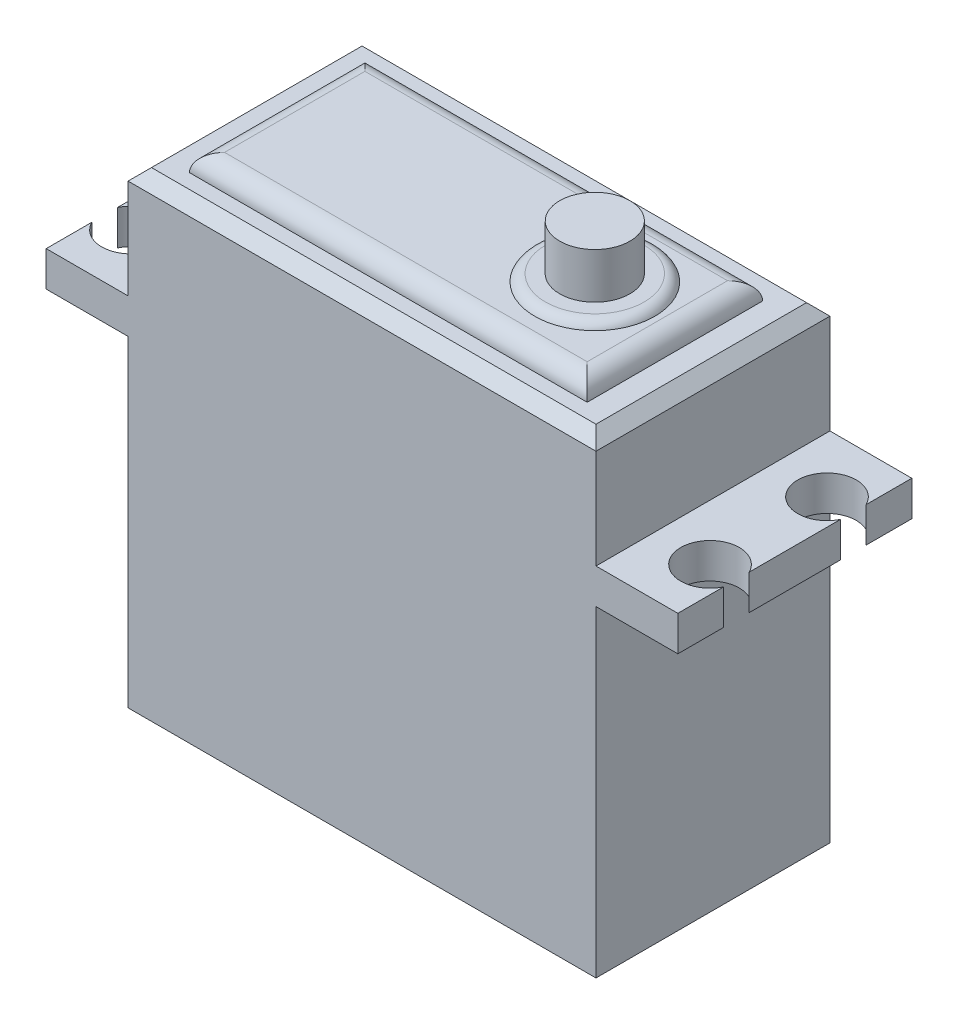
ISO-10303-21;
HEADER;
FILE_DESCRIPTION(('STEP AP214'),'2;1');
FILE_NAME('part.step','',(''),(''),'','','');
FILE_SCHEMA(('AUTOMOTIVE_DESIGN { 1 0 10303 214 1 1 1 1 }'));
ENDSEC;
DATA;
#1=APPLICATION_CONTEXT('core data for automotive mechanical design processes');
#2=APPLICATION_PROTOCOL_DEFINITION('international standard','automotive_design',2000,#1);
#3=PRODUCT_CONTEXT('',#1,'mechanical');
#4=PRODUCT('Part','Part','',(#3));
#5=PRODUCT_RELATED_PRODUCT_CATEGORY('part','',(#4));
#6=PRODUCT_DEFINITION_FORMATION('','',#4);
#7=PRODUCT_DEFINITION_CONTEXT('part definition',#1,'design');
#8=PRODUCT_DEFINITION('design','',#6,#7);
#9=PRODUCT_DEFINITION_SHAPE('','',#8);
#10=(LENGTH_UNIT() NAMED_UNIT(*) SI_UNIT(.MILLI.,.METRE.));
#11=(NAMED_UNIT(*) PLANE_ANGLE_UNIT() SI_UNIT($,.RADIAN.));
#12=(NAMED_UNIT(*) SI_UNIT($,.STERADIAN.) SOLID_ANGLE_UNIT());
#13=UNCERTAINTY_MEASURE_WITH_UNIT(LENGTH_MEASURE(1.E-05),#10,'distance_accuracy_value','');
#14=(GEOMETRIC_REPRESENTATION_CONTEXT(3) GLOBAL_UNCERTAINTY_ASSIGNED_CONTEXT((#13)) GLOBAL_UNIT_ASSIGNED_CONTEXT((#10,
#11,#12)) REPRESENTATION_CONTEXT('',''));
#15=CARTESIAN_POINT('',(0.,0.,0.));
#16=DIRECTION('',(0.,0.,1.));
#17=DIRECTION('',(1.,0.,0.));
#18=AXIS2_PLACEMENT_3D('',#15,#16,#17);
#19=CARTESIAN_POINT('',(0.,40.,0.));
#20=DIRECTION('',(0.,1.,0.));
#21=DIRECTION('',(0.,0.,1.));
#22=AXIS2_PLACEMENT_3D('',#19,#20,#21);
#23=PLANE('',#22);
#24=DIRECTION('',(-1.,0.,0.));
#25=VECTOR('',#24,1.);
#26=CARTESIAN_POINT('',(0.,40.,1.00000000000001));
#27=LINE('',#26,#25);
#28=CARTESIAN_POINT('',(39.,40.,1.00000000000001));
#29=VERTEX_POINT('',#28);
#30=CARTESIAN_POINT('',(1.00000000000001,40.,1.00000000000001));
#31=VERTEX_POINT('',#30);
#32=EDGE_CURVE('E254',#29,#31,#27,.T.);
#33=ORIENTED_EDGE('',*,*,#32,.T.);
#34=DIRECTION('',(0.,0.,1.));
#35=VECTOR('',#34,1.);
#36=CARTESIAN_POINT('',(1.00000000000001,40.,20.));
#37=LINE('',#36,#35);
#38=CARTESIAN_POINT('',(1.00000000000001,40.,19.));
#39=VERTEX_POINT('',#38);
#40=EDGE_CURVE('E260',#31,#39,#37,.T.);
#41=ORIENTED_EDGE('',*,*,#40,.T.);
#42=DIRECTION('',(1.,0.,0.));
#43=VECTOR('',#42,1.);
#44=CARTESIAN_POINT('',(40.,40.,19.));
#45=LINE('',#44,#43);
#46=CARTESIAN_POINT('',(39.,40.,19.));
#47=VERTEX_POINT('',#46);
#48=EDGE_CURVE('E258',#39,#47,#45,.T.);
#49=ORIENTED_EDGE('',*,*,#48,.T.);
#50=DIRECTION('',(0.,0.,-1.));
#51=VECTOR('',#50,1.);
#52=CARTESIAN_POINT('',(39.,40.,0.));
#53=LINE('',#52,#51);
#54=EDGE_CURVE('E256',#47,#29,#53,.T.);
#55=ORIENTED_EDGE('',*,*,#54,.T.);
#56=EDGE_LOOP('',(#33,#41,#49,#55));
#57=FACE_BOUND('',#56,.T.);
#58=DIRECTION('',(1.,0.,0.));
#59=VECTOR('',#58,1.);
#60=CARTESIAN_POINT('',(2.99999999999999,40.,17.7515960619115));
#61=LINE('',#60,#59);
#62=CARTESIAN_POINT('',(2.99999999999999,40.,17.7515960619115));
#63=VERTEX_POINT('',#62);
#64=CARTESIAN_POINT('',(37.,40.,17.7515960619115));
#65=VERTEX_POINT('',#64);
#66=EDGE_CURVE('E212',#63,#65,#61,.T.);
#67=ORIENTED_EDGE('',*,*,#66,.F.);
#68=DIRECTION('',(0.,0.,1.));
#69=VECTOR('',#68,1.);
#70=CARTESIAN_POINT('',(2.99999999999999,40.,17.7515960619115));
#71=LINE('',#70,#69);
#72=CARTESIAN_POINT('',(2.99999999999999,40.,2.75159606191146));
#73=VERTEX_POINT('',#72);
#74=EDGE_CURVE('E214',#73,#63,#71,.T.);
#75=ORIENTED_EDGE('',*,*,#74,.F.);
#76=DIRECTION('',(-1.,0.,0.));
#77=VECTOR('',#76,1.);
#78=CARTESIAN_POINT('',(2.99999999999999,40.,2.75159606191146));
#79=LINE('',#78,#77);
#80=CARTESIAN_POINT('',(37.,40.,2.75159606191146));
#81=VERTEX_POINT('',#80);
#82=EDGE_CURVE('E573',#81,#73,#79,.T.);
#83=ORIENTED_EDGE('',*,*,#82,.F.);
#84=DIRECTION('',(0.,0.,-1.));
#85=VECTOR('',#84,1.);
#86=CARTESIAN_POINT('',(37.,40.,17.7515960619115));
#87=LINE('',#86,#85);
#88=EDGE_CURVE('E216',#65,#81,#87,.T.);
#89=ORIENTED_EDGE('',*,*,#88,.F.);
#90=EDGE_LOOP('',(#67,#75,#83,#89));
#91=FACE_BOUND('',#90,.T.);
#92=ADVANCED_FACE('F39',(#57,#91),#23,.T.);
#93=CARTESIAN_POINT('',(0.,40.,0.));
#94=DIRECTION('',(1.,0.,0.));
#95=DIRECTION('',(0.,0.,-1.));
#96=AXIS2_PLACEMENT_3D('',#93,#94,#95);
#97=PLANE('',#96);
#98=DIRECTION('',(0.,0.,1.));
#99=VECTOR('',#98,1.);
#100=CARTESIAN_POINT('',(0.,27.5,20.));
#101=LINE('',#100,#99);
#102=CARTESIAN_POINT('',(0.,27.5,0.));
#103=VERTEX_POINT('',#102);
#104=CARTESIAN_POINT('',(0.,27.5,20.));
#105=VERTEX_POINT('',#104);
#106=EDGE_CURVE('E608',#103,#105,#101,.T.);
#107=ORIENTED_EDGE('',*,*,#106,.F.);
#108=DIRECTION('',(0.,-1.,0.));
#109=VECTOR('',#108,1.);
#110=CARTESIAN_POINT('',(0.,40.,0.));
#111=LINE('',#110,#109);
#112=CARTESIAN_POINT('',(0.,0.,0.));
#113=VERTEX_POINT('',#112);
#114=EDGE_CURVE('E703',#103,#113,#111,.T.);
#115=ORIENTED_EDGE('',*,*,#114,.T.);
#116=DIRECTION('',(0.,0.,1.));
#117=VECTOR('',#116,1.);
#118=CARTESIAN_POINT('',(0.,0.,0.));
#119=LINE('',#118,#117);
#120=CARTESIAN_POINT('',(0.,0.,20.));
#121=VERTEX_POINT('',#120);
#122=EDGE_CURVE('E682',#113,#121,#119,.T.);
#123=ORIENTED_EDGE('',*,*,#122,.T.);
#124=DIRECTION('',(0.,-1.,0.));
#125=VECTOR('',#124,1.);
#126=CARTESIAN_POINT('',(0.,40.,20.));
#127=LINE('',#126,#125);
#128=EDGE_CURVE('E303',#105,#121,#127,.T.);
#129=ORIENTED_EDGE('',*,*,#128,.F.);
#130=EDGE_LOOP('',(#107,#115,#123,#129));
#131=FACE_BOUND('',#130,.T.);
#132=ADVANCED_FACE('F310',(#131),#97,.F.);
#133=CARTESIAN_POINT('',(40.,40.,0.));
#134=DIRECTION('',(-1.,0.,0.));
#135=DIRECTION('',(0.,0.,1.));
#136=AXIS2_PLACEMENT_3D('',#133,#134,#135);
#137=PLANE('',#136);
#138=DIRECTION('',(0.,0.,-1.));
#139=VECTOR('',#138,1.);
#140=CARTESIAN_POINT('',(40.,27.5,20.));
#141=LINE('',#140,#139);
#142=CARTESIAN_POINT('',(40.,27.5,20.));
#143=VERTEX_POINT('',#142);
#144=CARTESIAN_POINT('',(40.,27.5,0.));
#145=VERTEX_POINT('',#144);
#146=EDGE_CURVE('E624',#143,#145,#141,.T.);
#147=ORIENTED_EDGE('',*,*,#146,.F.);
#148=DIRECTION('',(0.,-1.,0.));
#149=VECTOR('',#148,1.);
#150=CARTESIAN_POINT('',(40.,40.,20.));
#151=LINE('',#150,#149);
#152=CARTESIAN_POINT('',(40.,0.,20.));
#153=VERTEX_POINT('',#152);
#154=EDGE_CURVE('E709',#143,#153,#151,.T.);
#155=ORIENTED_EDGE('',*,*,#154,.T.);
#156=DIRECTION('',(0.,0.,-1.));
#157=VECTOR('',#156,1.);
#158=CARTESIAN_POINT('',(40.,0.,0.));
#159=LINE('',#158,#157);
#160=CARTESIAN_POINT('',(40.,0.,0.));
#161=VERTEX_POINT('',#160);
#162=EDGE_CURVE('E697',#153,#161,#159,.T.);
#163=ORIENTED_EDGE('',*,*,#162,.T.);
#164=DIRECTION('',(0.,-1.,0.));
#165=VECTOR('',#164,1.);
#166=CARTESIAN_POINT('',(40.,40.,0.));
#167=LINE('',#166,#165);
#168=EDGE_CURVE('E706',#145,#161,#167,.T.);
#169=ORIENTED_EDGE('',*,*,#168,.F.);
#170=EDGE_LOOP('',(#147,#155,#163,#169));
#171=FACE_BOUND('',#170,.T.);
#172=ADVANCED_FACE('F317',(#171),#137,.F.);
#173=CARTESIAN_POINT('',(0.,39.,20.));
#174=VERTEX_POINT('',#173);
#175=CARTESIAN_POINT('',(0.,30.5,20.));
#176=VERTEX_POINT('',#175);
#177=EDGE_CURVE('E292',#174,#176,#127,.T.);
#178=ORIENTED_EDGE('',*,*,#177,.F.);
#179=DIRECTION('',(0.,0.,-1.));
#180=VECTOR('',#179,1.);
#181=CARTESIAN_POINT('',(0.,39.,0.));
#182=LINE('',#181,#180);
#183=CARTESIAN_POINT('',(0.,39.,0.));
#184=VERTEX_POINT('',#183);
#185=EDGE_CURVE('E263',#174,#184,#182,.T.);
#186=ORIENTED_EDGE('',*,*,#185,.T.);
#187=CARTESIAN_POINT('',(0.,30.5,0.));
#188=VERTEX_POINT('',#187);
#189=EDGE_CURVE('E704',#184,#188,#111,.T.);
#190=ORIENTED_EDGE('',*,*,#189,.T.);
#191=DIRECTION('',(0.,0.,1.));
#192=VECTOR('',#191,1.);
#193=CARTESIAN_POINT('',(0.,30.5,20.));
#194=LINE('',#193,#192);
#195=EDGE_CURVE('E301',#188,#176,#194,.T.);
#196=ORIENTED_EDGE('',*,*,#195,.T.);
#197=EDGE_LOOP('',(#178,#186,#190,#196));
#198=FACE_BOUND('',#197,.T.);
#199=ADVANCED_FACE('F299',(#198),#97,.F.);
#200=CARTESIAN_POINT('',(0.,40.,20.));
#201=DIRECTION('',(0.,0.,-1.));
#202=DIRECTION('',(-1.,0.,0.));
#203=AXIS2_PLACEMENT_3D('',#200,#201,#202);
#204=PLANE('',#203);
#205=CARTESIAN_POINT('',(40.,39.,20.));
#206=VERTEX_POINT('',#205);
#207=CARTESIAN_POINT('',(40.,30.5,20.));
#208=VERTEX_POINT('',#207);
#209=EDGE_CURVE('E295',#206,#208,#151,.T.);
#210=ORIENTED_EDGE('',*,*,#209,.F.);
#211=DIRECTION('',(-1.,0.,0.));
#212=VECTOR('',#211,1.);
#213=CARTESIAN_POINT('',(0.,39.,20.));
#214=LINE('',#213,#212);
#215=EDGE_CURVE('E266',#206,#174,#214,.T.);
#216=ORIENTED_EDGE('',*,*,#215,.T.);
#217=ORIENTED_EDGE('',*,*,#177,.T.);
#218=DIRECTION('',(-1.,0.,0.));
#219=VECTOR('',#218,1.);
#220=CARTESIAN_POINT('',(0.,30.5,20.));
#221=LINE('',#220,#219);
#222=CARTESIAN_POINT('',(-7.,30.5,20.));
#223=VERTEX_POINT('',#222);
#224=EDGE_CURVE('E592',#176,#223,#221,.T.);
#225=ORIENTED_EDGE('',*,*,#224,.T.);
#226=DIRECTION('',(0.,-1.,0.));
#227=VECTOR('',#226,1.);
#228=CARTESIAN_POINT('',(-7.,30.5,20.));
#229=LINE('',#228,#227);
#230=CARTESIAN_POINT('',(-7.,27.5,20.));
#231=VERTEX_POINT('',#230);
#232=EDGE_CURVE('E629',#223,#231,#229,.T.);
#233=ORIENTED_EDGE('',*,*,#232,.T.);
#234=DIRECTION('',(-1.,0.,0.));
#235=VECTOR('',#234,1.);
#236=CARTESIAN_POINT('',(0.,27.5,20.));
#237=LINE('',#236,#235);
#238=EDGE_CURVE('E611',#105,#231,#237,.T.);
#239=ORIENTED_EDGE('',*,*,#238,.F.);
#240=ORIENTED_EDGE('',*,*,#128,.T.);
#241=DIRECTION('',(1.,0.,0.));
#242=VECTOR('',#241,1.);
#243=CARTESIAN_POINT('',(0.,0.,20.));
#244=LINE('',#243,#242);
#245=EDGE_CURVE('E694',#121,#153,#244,.T.);
#246=ORIENTED_EDGE('',*,*,#245,.T.);
#247=ORIENTED_EDGE('',*,*,#154,.F.);
#248=DIRECTION('',(-1.,0.,0.));
#249=VECTOR('',#248,1.);
#250=CARTESIAN_POINT('',(40.,27.5,20.));
#251=LINE('',#250,#249);
#252=CARTESIAN_POINT('',(47.,27.5,20.));
#253=VERTEX_POINT('',#252);
#254=EDGE_CURVE('E638',#253,#143,#251,.T.);
#255=ORIENTED_EDGE('',*,*,#254,.F.);
#256=DIRECTION('',(0.,-1.,0.));
#257=VECTOR('',#256,1.);
#258=CARTESIAN_POINT('',(47.,30.5,20.));
#259=LINE('',#258,#257);
#260=CARTESIAN_POINT('',(47.,30.5,20.));
#261=VERTEX_POINT('',#260);
#262=EDGE_CURVE('E680',#261,#253,#259,.T.);
#263=ORIENTED_EDGE('',*,*,#262,.F.);
#264=DIRECTION('',(-1.,0.,0.));
#265=VECTOR('',#264,1.);
#266=CARTESIAN_POINT('',(40.,30.5,20.));
#267=LINE('',#266,#265);
#268=EDGE_CURVE('E656',#261,#208,#267,.T.);
#269=ORIENTED_EDGE('',*,*,#268,.T.);
#270=EDGE_LOOP('',(#210,#216,#217,#225,#233,#239,#240,#246,#247,#255,#263,#269));
#271=FACE_BOUND('',#270,.T.);
#272=ADVANCED_FACE('F290',(#271),#204,.F.);
#273=CARTESIAN_POINT('',(40.,39.,0.));
#274=VERTEX_POINT('',#273);
#275=CARTESIAN_POINT('',(40.,30.5,0.));
#276=VERTEX_POINT('',#275);
#277=EDGE_CURVE('E707',#274,#276,#167,.T.);
#278=ORIENTED_EDGE('',*,*,#277,.F.);
#279=DIRECTION('',(0.,0.,1.));
#280=VECTOR('',#279,1.);
#281=CARTESIAN_POINT('',(40.,39.,20.));
#282=LINE('',#281,#280);
#283=EDGE_CURVE('E48',#274,#206,#282,.T.);
#284=ORIENTED_EDGE('',*,*,#283,.T.);
#285=ORIENTED_EDGE('',*,*,#209,.T.);
#286=DIRECTION('',(0.,0.,-1.));
#287=VECTOR('',#286,1.);
#288=CARTESIAN_POINT('',(40.,30.5,20.));
#289=LINE('',#288,#287);
#290=EDGE_CURVE('E634',#208,#276,#289,.T.);
#291=ORIENTED_EDGE('',*,*,#290,.T.);
#292=EDGE_LOOP('',(#278,#284,#285,#291));
#293=FACE_BOUND('',#292,.T.);
#294=ADVANCED_FACE('F332',(#293),#137,.F.);
#295=CARTESIAN_POINT('',(0.,40.,0.));
#296=DIRECTION('',(0.,0.,1.));
#297=DIRECTION('',(1.,0.,0.));
#298=AXIS2_PLACEMENT_3D('',#295,#296,#297);
#299=PLANE('',#298);
#300=ORIENTED_EDGE('',*,*,#189,.F.);
#301=DIRECTION('',(1.,0.,0.));
#302=VECTOR('',#301,1.);
#303=CARTESIAN_POINT('',(40.,39.,0.));
#304=LINE('',#303,#302);
#305=EDGE_CURVE('E11',#184,#274,#304,.T.);
#306=ORIENTED_EDGE('',*,*,#305,.T.);
#307=ORIENTED_EDGE('',*,*,#277,.T.);
#308=DIRECTION('',(1.,0.,0.));
#309=VECTOR('',#308,1.);
#310=CARTESIAN_POINT('',(47.,30.5,0.));
#311=LINE('',#310,#309);
#312=CARTESIAN_POINT('',(47.,30.5,0.));
#313=VERTEX_POINT('',#312);
#314=EDGE_CURVE('E637',#276,#313,#311,.T.);
#315=ORIENTED_EDGE('',*,*,#314,.T.);
#316=DIRECTION('',(0.,-1.,0.));
#317=VECTOR('',#316,1.);
#318=CARTESIAN_POINT('',(47.,30.5,0.));
#319=LINE('',#318,#317);
#320=CARTESIAN_POINT('',(47.,27.5,0.));
#321=VERTEX_POINT('',#320);
#322=EDGE_CURVE('E658',#313,#321,#319,.T.);
#323=ORIENTED_EDGE('',*,*,#322,.T.);
#324=DIRECTION('',(1.,0.,0.));
#325=VECTOR('',#324,1.);
#326=CARTESIAN_POINT('',(47.,27.5,0.));
#327=LINE('',#326,#325);
#328=EDGE_CURVE('E661',#145,#321,#327,.T.);
#329=ORIENTED_EDGE('',*,*,#328,.F.);
#330=ORIENTED_EDGE('',*,*,#168,.T.);
#331=DIRECTION('',(-1.,0.,0.));
#332=VECTOR('',#331,1.);
#333=CARTESIAN_POINT('',(0.,0.,0.));
#334=LINE('',#333,#332);
#335=EDGE_CURVE('E700',#161,#113,#334,.T.);
#336=ORIENTED_EDGE('',*,*,#335,.T.);
#337=ORIENTED_EDGE('',*,*,#114,.F.);
#338=DIRECTION('',(1.,0.,0.));
#339=VECTOR('',#338,1.);
#340=CARTESIAN_POINT('',(-6.99999999999999,27.5,0.));
#341=LINE('',#340,#339);
#342=CARTESIAN_POINT('',(-6.99999999999999,27.5,0.));
#343=VERTEX_POINT('',#342);
#344=EDGE_CURVE('E606',#343,#103,#341,.T.);
#345=ORIENTED_EDGE('',*,*,#344,.F.);
#346=DIRECTION('',(0.,-1.,0.));
#347=VECTOR('',#346,1.);
#348=CARTESIAN_POINT('',(-6.99999999999999,30.5,0.));
#349=LINE('',#348,#347);
#350=CARTESIAN_POINT('',(-6.99999999999999,30.5,0.));
#351=VERTEX_POINT('',#350);
#352=EDGE_CURVE('E631',#351,#343,#349,.T.);
#353=ORIENTED_EDGE('',*,*,#352,.F.);
#354=DIRECTION('',(1.,0.,0.));
#355=VECTOR('',#354,1.);
#356=CARTESIAN_POINT('',(-6.99999999999999,30.5,0.));
#357=LINE('',#356,#355);
#358=EDGE_CURVE('E588',#351,#188,#357,.T.);
#359=ORIENTED_EDGE('',*,*,#358,.T.);
#360=EDGE_LOOP('',(#300,#306,#307,#315,#323,#329,#330,#336,#337,#345,#353,#359));
#361=FACE_BOUND('',#360,.T.);
#362=ADVANCED_FACE('F328',(#361),#299,.F.);
#363=CARTESIAN_POINT('',(0.,0.,0.));
#364=DIRECTION('',(0.,1.,0.));
#365=DIRECTION('',(0.,0.,1.));
#366=AXIS2_PLACEMENT_3D('',#363,#364,#365);
#367=PLANE('',#366);
#368=ORIENTED_EDGE('',*,*,#122,.F.);
#369=ORIENTED_EDGE('',*,*,#335,.F.);
#370=ORIENTED_EDGE('',*,*,#162,.F.);
#371=ORIENTED_EDGE('',*,*,#245,.F.);
#372=EDGE_LOOP('',(#368,#369,#370,#371));
#373=FACE_BOUND('',#372,.T.);
#374=ADVANCED_FACE('F324',(#373),#367,.F.);
#375=CARTESIAN_POINT('',(47.,30.5,20.));
#376=DIRECTION('',(1.,0.,0.));
#377=DIRECTION('',(0.,0.,-1.));
#378=AXIS2_PLACEMENT_3D('',#375,#376,#377);
#379=PLANE('',#378);
#380=DIRECTION('',(0.,0.,1.));
#381=VECTOR('',#380,1.);
#382=CARTESIAN_POINT('',(47.,27.5,20.));
#383=LINE('',#382,#381);
#384=CARTESIAN_POINT('',(47.,27.5,16.0897247358852));
#385=VERTEX_POINT('',#384);
#386=EDGE_CURVE('E676',#385,#253,#383,.T.);
#387=ORIENTED_EDGE('',*,*,#386,.F.);
#388=DIRECTION('',(0.,-1.,0.));
#389=VECTOR('',#388,1.);
#390=CARTESIAN_POINT('',(47.,30.5,16.0897247358852));
#391=LINE('',#390,#389);
#392=CARTESIAN_POINT('',(47.,30.5,16.0897247358852));
#393=VERTEX_POINT('',#392);
#394=EDGE_CURVE('E683',#393,#385,#391,.T.);
#395=ORIENTED_EDGE('',*,*,#394,.F.);
#396=DIRECTION('',(0.,0.,1.));
#397=VECTOR('',#396,1.);
#398=CARTESIAN_POINT('',(47.,30.5,20.));
#399=LINE('',#398,#397);
#400=EDGE_CURVE('E653',#393,#261,#399,.T.);
#401=ORIENTED_EDGE('',*,*,#400,.T.);
#402=ORIENTED_EDGE('',*,*,#262,.T.);
#403=EDGE_LOOP('',(#387,#395,#401,#402));
#404=FACE_BOUND('',#403,.T.);
#405=ADVANCED_FACE('F327',(#404),#379,.T.);
#406=CARTESIAN_POINT('',(44.75,30.5,15.));
#407=DIRECTION('',(0.,-1.,0.));
#408=DIRECTION('',(0.,0.,-1.));
#409=AXIS2_PLACEMENT_3D('',#406,#407,#408);
#410=CYLINDRICAL_SURFACE('',#409,2.5);
#411=CARTESIAN_POINT('',(44.75,27.5,15.));
#412=DIRECTION('',(0.,1.,0.));
#413=DIRECTION('',(0.,0.,-1.));
#414=AXIS2_PLACEMENT_3D('',#411,#412,#413);
#415=CIRCLE('',#414,2.5);
#416=CARTESIAN_POINT('',(47.,27.5,13.9102752641148));
#417=VERTEX_POINT('',#416);
#418=EDGE_CURVE('E673',#417,#385,#415,.T.);
#419=ORIENTED_EDGE('',*,*,#418,.F.);
#420=DIRECTION('',(0.,-1.,0.));
#421=VECTOR('',#420,1.);
#422=CARTESIAN_POINT('',(47.,30.5,13.9102752641148));
#423=LINE('',#422,#421);
#424=CARTESIAN_POINT('',(47.,30.5,13.9102752641148));
#425=VERTEX_POINT('',#424);
#426=EDGE_CURVE('E685',#425,#417,#423,.T.);
#427=ORIENTED_EDGE('',*,*,#426,.F.);
#428=CARTESIAN_POINT('',(44.75,30.5,15.));
#429=DIRECTION('',(0.,1.,0.));
#430=DIRECTION('',(0.,0.,-1.));
#431=AXIS2_PLACEMENT_3D('',#428,#429,#430);
#432=CIRCLE('',#431,2.5);
#433=EDGE_CURVE('E650',#425,#393,#432,.T.);
#434=ORIENTED_EDGE('',*,*,#433,.T.);
#435=ORIENTED_EDGE('',*,*,#394,.T.);
#436=EDGE_LOOP('',(#419,#427,#434,#435));
#437=FACE_BOUND('',#436,.T.);
#438=ADVANCED_FACE('F413',(#437),#410,.F.);
#439=CARTESIAN_POINT('',(47.,30.5,13.9102752641148));
#440=DIRECTION('',(1.,0.,0.));
#441=DIRECTION('',(0.,0.,-1.));
#442=AXIS2_PLACEMENT_3D('',#439,#440,#441);
#443=PLANE('',#442);
#444=DIRECTION('',(0.,0.,1.));
#445=VECTOR('',#444,1.);
#446=CARTESIAN_POINT('',(47.,27.5,13.9102752641148));
#447=LINE('',#446,#445);
#448=CARTESIAN_POINT('',(47.,27.5,6.08972473588517));
#449=VERTEX_POINT('',#448);
#450=EDGE_CURVE('E670',#449,#417,#447,.T.);
#451=ORIENTED_EDGE('',*,*,#450,.F.);
#452=DIRECTION('',(0.,-1.,0.));
#453=VECTOR('',#452,1.);
#454=CARTESIAN_POINT('',(47.,30.5,6.08972473588517));
#455=LINE('',#454,#453);
#456=CARTESIAN_POINT('',(47.,30.5,6.08972473588517));
#457=VERTEX_POINT('',#456);
#458=EDGE_CURVE('E687',#457,#449,#455,.T.);
#459=ORIENTED_EDGE('',*,*,#458,.F.);
#460=DIRECTION('',(0.,0.,1.));
#461=VECTOR('',#460,1.);
#462=CARTESIAN_POINT('',(47.,30.5,13.9102752641148));
#463=LINE('',#462,#461);
#464=EDGE_CURVE('E647',#457,#425,#463,.T.);
#465=ORIENTED_EDGE('',*,*,#464,.T.);
#466=ORIENTED_EDGE('',*,*,#426,.T.);
#467=EDGE_LOOP('',(#451,#459,#465,#466));
#468=FACE_BOUND('',#467,.T.);
#469=ADVANCED_FACE('F421',(#468),#443,.T.);
#470=CARTESIAN_POINT('',(44.75,30.5,5.));
#471=DIRECTION('',(0.,-1.,0.));
#472=DIRECTION('',(0.,0.,-1.));
#473=AXIS2_PLACEMENT_3D('',#470,#471,#472);
#474=CYLINDRICAL_SURFACE('',#473,2.5);
#475=CARTESIAN_POINT('',(44.75,27.5,5.));
#476=DIRECTION('',(0.,1.,0.));
#477=DIRECTION('',(0.,0.,-1.));
#478=AXIS2_PLACEMENT_3D('',#475,#476,#477);
#479=CIRCLE('',#478,2.5);
#480=CARTESIAN_POINT('',(47.,27.5,3.91027526411483));
#481=VERTEX_POINT('',#480);
#482=EDGE_CURVE('E667',#481,#449,#479,.T.);
#483=ORIENTED_EDGE('',*,*,#482,.F.);
#484=DIRECTION('',(0.,-1.,0.));
#485=VECTOR('',#484,1.);
#486=CARTESIAN_POINT('',(47.,30.5,3.91027526411483));
#487=LINE('',#486,#485);
#488=CARTESIAN_POINT('',(47.,30.5,3.91027526411483));
#489=VERTEX_POINT('',#488);
#490=EDGE_CURVE('E689',#489,#481,#487,.T.);
#491=ORIENTED_EDGE('',*,*,#490,.F.);
#492=CARTESIAN_POINT('',(44.75,30.5,5.));
#493=DIRECTION('',(0.,1.,0.));
#494=DIRECTION('',(0.,0.,-1.));
#495=AXIS2_PLACEMENT_3D('',#492,#493,#494);
#496=CIRCLE('',#495,2.5);
#497=EDGE_CURVE('E644',#489,#457,#496,.T.);
#498=ORIENTED_EDGE('',*,*,#497,.T.);
#499=ORIENTED_EDGE('',*,*,#458,.T.);
#500=EDGE_LOOP('',(#483,#491,#498,#499));
#501=FACE_BOUND('',#500,.T.);
#502=ADVANCED_FACE('F429',(#501),#474,.F.);
#503=CARTESIAN_POINT('',(47.,30.5,3.91027526411483));
#504=DIRECTION('',(1.,0.,0.));
#505=DIRECTION('',(0.,0.,-1.));
#506=AXIS2_PLACEMENT_3D('',#503,#504,#505);
#507=PLANE('',#506);
#508=DIRECTION('',(0.,0.,1.));
#509=VECTOR('',#508,1.);
#510=CARTESIAN_POINT('',(47.,27.5,3.91027526411483));
#511=LINE('',#510,#509);
#512=EDGE_CURVE('E664',#321,#481,#511,.T.);
#513=ORIENTED_EDGE('',*,*,#512,.F.);
#514=ORIENTED_EDGE('',*,*,#322,.F.);
#515=DIRECTION('',(0.,0.,1.));
#516=VECTOR('',#515,1.);
#517=CARTESIAN_POINT('',(47.,30.5,3.91027526411483));
#518=LINE('',#517,#516);
#519=EDGE_CURVE('E641',#313,#489,#518,.T.);
#520=ORIENTED_EDGE('',*,*,#519,.T.);
#521=ORIENTED_EDGE('',*,*,#490,.T.);
#522=EDGE_LOOP('',(#513,#514,#520,#521));
#523=FACE_BOUND('',#522,.T.);
#524=ADVANCED_FACE('F322',(#523),#507,.T.);
#525=CARTESIAN_POINT('',(44.75,30.5,5.));
#526=DIRECTION('',(0.,-1.,0.));
#527=DIRECTION('',(0.,0.,-1.));
#528=AXIS2_PLACEMENT_3D('',#525,#526,#527);
#529=PLANE('',#528);
#530=ORIENTED_EDGE('',*,*,#290,.F.);
#531=ORIENTED_EDGE('',*,*,#268,.F.);
#532=ORIENTED_EDGE('',*,*,#400,.F.);
#533=ORIENTED_EDGE('',*,*,#433,.F.);
#534=ORIENTED_EDGE('',*,*,#464,.F.);
#535=ORIENTED_EDGE('',*,*,#497,.F.);
#536=ORIENTED_EDGE('',*,*,#519,.F.);
#537=ORIENTED_EDGE('',*,*,#314,.F.);
#538=EDGE_LOOP('',(#530,#531,#532,#533,#534,#535,#536,#537));
#539=FACE_BOUND('',#538,.T.);
#540=ADVANCED_FACE('F443',(#539),#529,.F.);
#541=CARTESIAN_POINT('',(44.75,27.5,5.));
#542=DIRECTION('',(0.,-1.,0.));
#543=DIRECTION('',(0.,0.,-1.));
#544=AXIS2_PLACEMENT_3D('',#541,#542,#543);
#545=PLANE('',#544);
#546=ORIENTED_EDGE('',*,*,#146,.T.);
#547=ORIENTED_EDGE('',*,*,#328,.T.);
#548=ORIENTED_EDGE('',*,*,#512,.T.);
#549=ORIENTED_EDGE('',*,*,#482,.T.);
#550=ORIENTED_EDGE('',*,*,#450,.T.);
#551=ORIENTED_EDGE('',*,*,#418,.T.);
#552=ORIENTED_EDGE('',*,*,#386,.T.);
#553=ORIENTED_EDGE('',*,*,#254,.T.);
#554=EDGE_LOOP('',(#546,#547,#548,#549,#550,#551,#552,#553));
#555=FACE_BOUND('',#554,.T.);
#556=ADVANCED_FACE('F450',(#555),#545,.T.);
#557=CARTESIAN_POINT('',(-4.74999999999999,30.5,4.99999999999999));
#558=DIRECTION('',(0.,-1.,0.));
#559=DIRECTION('',(0.,0.,-1.));
#560=AXIS2_PLACEMENT_3D('',#557,#558,#559);
#561=CYLINDRICAL_SURFACE('',#560,2.5);
#562=CARTESIAN_POINT('',(-4.74999999999999,27.5,4.99999999999999));
#563=DIRECTION('',(0.,1.,0.));
#564=DIRECTION('',(0.,0.,1.));
#565=AXIS2_PLACEMENT_3D('',#562,#563,#564);
#566=CIRCLE('',#565,2.5);
#567=CARTESIAN_POINT('',(-6.99999999999999,27.5,6.08972473588516));
#568=VERTEX_POINT('',#567);
#569=CARTESIAN_POINT('',(-6.99999999999999,27.5,3.91027526411482));
#570=VERTEX_POINT('',#569);
#571=EDGE_CURVE('E572',#568,#570,#566,.T.);
#572=ORIENTED_EDGE('',*,*,#571,.F.);
#573=DIRECTION('',(0.,-1.,0.));
#574=VECTOR('',#573,1.);
#575=CARTESIAN_POINT('',(-6.99999999999999,30.5,6.08972473588516));
#576=LINE('',#575,#574);
#577=CARTESIAN_POINT('',(-6.99999999999999,30.5,6.08972473588516));
#578=VERTEX_POINT('',#577);
#579=EDGE_CURVE('E622',#578,#568,#576,.T.);
#580=ORIENTED_EDGE('',*,*,#579,.F.);
#581=CARTESIAN_POINT('',(-4.74999999999999,30.5,4.99999999999999));
#582=DIRECTION('',(0.,1.,0.));
#583=DIRECTION('',(0.,0.,1.));
#584=AXIS2_PLACEMENT_3D('',#581,#582,#583);
#585=CIRCLE('',#584,2.5);
#586=CARTESIAN_POINT('',(-6.99999999999999,30.5,3.91027526411482));
#587=VERTEX_POINT('',#586);
#588=EDGE_CURVE('E581',#578,#587,#585,.T.);
#589=ORIENTED_EDGE('',*,*,#588,.T.);
#590=DIRECTION('',(0.,-1.,0.));
#591=VECTOR('',#590,1.);
#592=CARTESIAN_POINT('',(-6.99999999999999,30.5,3.91027526411482));
#593=LINE('',#592,#591);
#594=EDGE_CURVE('E602',#587,#570,#593,.T.);
#595=ORIENTED_EDGE('',*,*,#594,.T.);
#596=EDGE_LOOP('',(#572,#580,#589,#595));
#597=FACE_BOUND('',#596,.T.);
#598=ADVANCED_FACE('F458',(#597),#561,.F.);
#599=CARTESIAN_POINT('',(-6.99999999999999,30.5,13.9102752641148));
#600=DIRECTION('',(-1.,0.,0.));
#601=DIRECTION('',(0.,0.,1.));
#602=AXIS2_PLACEMENT_3D('',#599,#600,#601);
#603=PLANE('',#602);
#604=DIRECTION('',(0.,0.,-1.));
#605=VECTOR('',#604,1.);
#606=CARTESIAN_POINT('',(-6.99999999999999,27.5,13.9102752641148));
#607=LINE('',#606,#605);
#608=CARTESIAN_POINT('',(-6.99999999999999,27.5,13.9102752641148));
#609=VERTEX_POINT('',#608);
#610=EDGE_CURVE('E585',#609,#568,#607,.T.);
#611=ORIENTED_EDGE('',*,*,#610,.F.);
#612=DIRECTION('',(0.,-1.,0.));
#613=VECTOR('',#612,1.);
#614=CARTESIAN_POINT('',(-6.99999999999999,30.5,13.9102752641148));
#615=LINE('',#614,#613);
#616=CARTESIAN_POINT('',(-6.99999999999999,30.5,13.9102752641148));
#617=VERTEX_POINT('',#616);
#618=EDGE_CURVE('E625',#617,#609,#615,.T.);
#619=ORIENTED_EDGE('',*,*,#618,.F.);
#620=DIRECTION('',(0.,0.,-1.));
#621=VECTOR('',#620,1.);
#622=CARTESIAN_POINT('',(-6.99999999999999,30.5,13.9102752641148));
#623=LINE('',#622,#621);
#624=EDGE_CURVE('E600',#617,#578,#623,.T.);
#625=ORIENTED_EDGE('',*,*,#624,.T.);
#626=ORIENTED_EDGE('',*,*,#579,.T.);
#627=EDGE_LOOP('',(#611,#619,#625,#626));
#628=FACE_BOUND('',#627,.T.);
#629=ADVANCED_FACE('F466',(#628),#603,.T.);
#630=CARTESIAN_POINT('',(-4.74999999999999,30.5,15.));
#631=DIRECTION('',(0.,-1.,0.));
#632=DIRECTION('',(0.,0.,-1.));
#633=AXIS2_PLACEMENT_3D('',#630,#631,#632);
#634=CYLINDRICAL_SURFACE('',#633,2.5);
#635=CARTESIAN_POINT('',(-4.74999999999999,27.5,15.));
#636=DIRECTION('',(0.,1.,0.));
#637=DIRECTION('',(0.,0.,1.));
#638=AXIS2_PLACEMENT_3D('',#635,#636,#637);
#639=CIRCLE('',#638,2.5);
#640=CARTESIAN_POINT('',(-6.99999999999999,27.5,16.0897247358852));
#641=VERTEX_POINT('',#640);
#642=EDGE_CURVE('E617',#641,#609,#639,.T.);
#643=ORIENTED_EDGE('',*,*,#642,.F.);
#644=DIRECTION('',(0.,-1.,0.));
#645=VECTOR('',#644,1.);
#646=CARTESIAN_POINT('',(-6.99999999999999,30.5,16.0897247358852));
#647=LINE('',#646,#645);
#648=CARTESIAN_POINT('',(-6.99999999999999,30.5,16.0897247358852));
#649=VERTEX_POINT('',#648);
#650=EDGE_CURVE('E627',#649,#641,#647,.T.);
#651=ORIENTED_EDGE('',*,*,#650,.F.);
#652=CARTESIAN_POINT('',(-4.74999999999999,30.5,15.));
#653=DIRECTION('',(0.,1.,0.));
#654=DIRECTION('',(0.,0.,1.));
#655=AXIS2_PLACEMENT_3D('',#652,#653,#654);
#656=CIRCLE('',#655,2.5);
#657=EDGE_CURVE('E597',#649,#617,#656,.T.);
#658=ORIENTED_EDGE('',*,*,#657,.T.);
#659=ORIENTED_EDGE('',*,*,#618,.T.);
#660=EDGE_LOOP('',(#643,#651,#658,#659));
#661=FACE_BOUND('',#660,.T.);
#662=ADVANCED_FACE('F474',(#661),#634,.F.);
#663=CARTESIAN_POINT('',(-7.,30.5,20.));
#664=DIRECTION('',(-1.,0.,0.));
#665=DIRECTION('',(0.,0.,1.));
#666=AXIS2_PLACEMENT_3D('',#663,#664,#665);
#667=PLANE('',#666);
#668=DIRECTION('',(0.,0.,-1.));
#669=VECTOR('',#668,1.);
#670=CARTESIAN_POINT('',(-7.,27.5,20.));
#671=LINE('',#670,#669);
#672=EDGE_CURVE('E614',#231,#641,#671,.T.);
#673=ORIENTED_EDGE('',*,*,#672,.F.);
#674=ORIENTED_EDGE('',*,*,#232,.F.);
#675=DIRECTION('',(0.,0.,-1.));
#676=VECTOR('',#675,1.);
#677=CARTESIAN_POINT('',(-7.,30.5,20.));
#678=LINE('',#677,#676);
#679=EDGE_CURVE('E594',#223,#649,#678,.T.);
#680=ORIENTED_EDGE('',*,*,#679,.T.);
#681=ORIENTED_EDGE('',*,*,#650,.T.);
#682=EDGE_LOOP('',(#673,#674,#680,#681));
#683=FACE_BOUND('',#682,.T.);
#684=ADVANCED_FACE('F482',(#683),#667,.T.);
#685=CARTESIAN_POINT('',(-6.99999999999999,30.5,3.91027526411482));
#686=DIRECTION('',(-1.,0.,0.));
#687=DIRECTION('',(0.,0.,1.));
#688=AXIS2_PLACEMENT_3D('',#685,#686,#687);
#689=PLANE('',#688);
#690=DIRECTION('',(0.,0.,-1.));
#691=VECTOR('',#690,1.);
#692=CARTESIAN_POINT('',(-6.99999999999999,27.5,3.91027526411482));
#693=LINE('',#692,#691);
#694=EDGE_CURVE('E576',#570,#343,#693,.T.);
#695=ORIENTED_EDGE('',*,*,#694,.F.);
#696=ORIENTED_EDGE('',*,*,#594,.F.);
#697=DIRECTION('',(0.,0.,-1.));
#698=VECTOR('',#697,1.);
#699=CARTESIAN_POINT('',(-6.99999999999999,30.5,3.91027526411482));
#700=LINE('',#699,#698);
#701=EDGE_CURVE('E584',#587,#351,#700,.T.);
#702=ORIENTED_EDGE('',*,*,#701,.T.);
#703=ORIENTED_EDGE('',*,*,#352,.T.);
#704=EDGE_LOOP('',(#695,#696,#702,#703));
#705=FACE_BOUND('',#704,.T.);
#706=ADVANCED_FACE('F490',(#705),#689,.T.);
#707=CARTESIAN_POINT('',(-4.74999999999999,30.5,4.99999999999999));
#708=DIRECTION('',(0.,1.,0.));
#709=DIRECTION('',(0.,0.,1.));
#710=AXIS2_PLACEMENT_3D('',#707,#708,#709);
#711=PLANE('',#710);
#712=ORIENTED_EDGE('',*,*,#588,.F.);
#713=ORIENTED_EDGE('',*,*,#624,.F.);
#714=ORIENTED_EDGE('',*,*,#657,.F.);
#715=ORIENTED_EDGE('',*,*,#679,.F.);
#716=ORIENTED_EDGE('',*,*,#224,.F.);
#717=ORIENTED_EDGE('',*,*,#195,.F.);
#718=ORIENTED_EDGE('',*,*,#358,.F.);
#719=ORIENTED_EDGE('',*,*,#701,.F.);
#720=EDGE_LOOP('',(#712,#713,#714,#715,#716,#717,#718,#719));
#721=FACE_BOUND('',#720,.T.);
#722=ADVANCED_FACE('F498',(#721),#711,.T.);
#723=CARTESIAN_POINT('',(-4.74999999999999,27.5,4.99999999999999));
#724=DIRECTION('',(0.,1.,0.));
#725=DIRECTION('',(0.,0.,1.));
#726=AXIS2_PLACEMENT_3D('',#723,#724,#725);
#727=PLANE('',#726);
#728=ORIENTED_EDGE('',*,*,#571,.T.);
#729=ORIENTED_EDGE('',*,*,#694,.T.);
#730=ORIENTED_EDGE('',*,*,#344,.T.);
#731=ORIENTED_EDGE('',*,*,#106,.T.);
#732=ORIENTED_EDGE('',*,*,#238,.T.);
#733=ORIENTED_EDGE('',*,*,#672,.T.);
#734=ORIENTED_EDGE('',*,*,#642,.T.);
#735=ORIENTED_EDGE('',*,*,#610,.T.);
#736=EDGE_LOOP('',(#728,#729,#730,#731,#732,#733,#734,#735));
#737=FACE_BOUND('',#736,.T.);
#738=ADVANCED_FACE('F506',(#737),#727,.F.);
#739=CARTESIAN_POINT('',(0.,41.5,0.));
#740=DIRECTION('',(0.,-1.,0.));
#741=DIRECTION('',(0.,0.,-1.));
#742=AXIS2_PLACEMENT_3D('',#739,#740,#741);
#743=PLANE('',#742);
#744=CARTESIAN_POINT('',(29.9,41.5,10.));
#745=DIRECTION('',(0.,-1.,0.));
#746=DIRECTION('',(0.,0.,-1.));
#747=AXIS2_PLACEMENT_3D('',#744,#745,#746);
#748=CIRCLE('',#747,5.13032369482585);
#749=CARTESIAN_POINT('',(29.9,41.5,4.86967630517415));
#750=VERTEX_POINT('',#749);
#751=EDGE_CURVE('E248',#750,#750,#748,.F.);
#752=ORIENTED_EDGE('',*,*,#751,.F.);
#753=EDGE_LOOP('',(#752));
#754=FACE_BOUND('',#753,.T.);
#755=DIRECTION('',(-1.,0.,0.));
#756=VECTOR('',#755,1.);
#757=CARTESIAN_POINT('',(0.,41.5,4.25159606191146));
#758=LINE('',#757,#756);
#759=CARTESIAN_POINT('',(35.5,41.5,4.25159606191146));
#760=VERTEX_POINT('',#759);
#761=CARTESIAN_POINT('',(4.49999999999999,41.5,4.25159606191146));
#762=VERTEX_POINT('',#761);
#763=EDGE_CURVE('E302',#760,#762,#758,.T.);
#764=ORIENTED_EDGE('',*,*,#763,.T.);
#765=DIRECTION('',(0.,0.,1.));
#766=VECTOR('',#765,1.);
#767=CARTESIAN_POINT('',(4.49999999999999,41.5,0.));
#768=LINE('',#767,#766);
#769=CARTESIAN_POINT('',(4.49999999999999,41.5,16.2515960619115));
#770=VERTEX_POINT('',#769);
#771=EDGE_CURVE('E242',#762,#770,#768,.T.);
#772=ORIENTED_EDGE('',*,*,#771,.T.);
#773=DIRECTION('',(1.,0.,0.));
#774=VECTOR('',#773,1.);
#775=CARTESIAN_POINT('',(0.,41.5,16.2515960619115));
#776=LINE('',#775,#774);
#777=CARTESIAN_POINT('',(35.5,41.5,16.2515960619115));
#778=VERTEX_POINT('',#777);
#779=EDGE_CURVE('E233',#770,#778,#776,.T.);
#780=ORIENTED_EDGE('',*,*,#779,.T.);
#781=DIRECTION('',(0.,0.,-1.));
#782=VECTOR('',#781,1.);
#783=CARTESIAN_POINT('',(35.5,41.5,0.));
#784=LINE('',#783,#782);
#785=EDGE_CURVE('E712',#778,#760,#784,.T.);
#786=ORIENTED_EDGE('',*,*,#785,.T.);
#787=EDGE_LOOP('',(#764,#772,#780,#786));
#788=FACE_BOUND('',#787,.T.);
#789=ADVANCED_FACE('F349',(#754,#788),#743,.F.);
#790=CARTESIAN_POINT('',(35.5,40.,0.));
#791=DIRECTION('',(0.,0.,-1.));
#792=DIRECTION('',(-1.,0.,0.));
#793=AXIS2_PLACEMENT_3D('',#790,#791,#792);
#794=CYLINDRICAL_SURFACE('',#793,1.5);
#795=CARTESIAN_POINT('',(35.5,40.,16.2515960619115));
#796=DIRECTION('',(0.707106781186547,0.,-0.707106781186547));
#797=DIRECTION('',(-0.707106781186547,0.,-0.707106781186547));
#798=AXIS2_PLACEMENT_3D('',#795,#796,#797);
#799=ELLIPSE('',#798,2.12132034355964,1.5);
#800=EDGE_CURVE('E237',#65,#778,#799,.F.);
#801=ORIENTED_EDGE('',*,*,#800,.F.);
#802=ORIENTED_EDGE('',*,*,#88,.T.);
#803=CARTESIAN_POINT('',(35.5,40.,4.25159606191146));
#804=DIRECTION('',(-0.707106781186547,0.,-0.707106781186547));
#805=DIRECTION('',(-0.707106781186547,0.,0.707106781186547));
#806=AXIS2_PLACEMENT_3D('',#803,#804,#805);
#807=ELLIPSE('',#806,2.12132034355964,1.5);
#808=EDGE_CURVE('E230',#760,#81,#807,.T.);
#809=ORIENTED_EDGE('',*,*,#808,.F.);
#810=ORIENTED_EDGE('',*,*,#785,.F.);
#811=EDGE_LOOP('',(#801,#802,#809,#810));
#812=FACE_BOUND('',#811,.T.);
#813=ADVANCED_FACE('F345',(#812),#794,.T.);
#814=CARTESIAN_POINT('',(0.,40.,4.25159606191146));
#815=DIRECTION('',(-1.,0.,0.));
#816=DIRECTION('',(0.,0.,1.));
#817=AXIS2_PLACEMENT_3D('',#814,#815,#816);
#818=CYLINDRICAL_SURFACE('',#817,1.5);
#819=ORIENTED_EDGE('',*,*,#808,.T.);
#820=ORIENTED_EDGE('',*,*,#82,.T.);
#821=CARTESIAN_POINT('',(4.49999999999999,40.,4.25159606191146));
#822=DIRECTION('',(-0.707106781186547,0.,0.707106781186547));
#823=DIRECTION('',(-0.707106781186547,0.,-0.707106781186547));
#824=AXIS2_PLACEMENT_3D('',#821,#822,#823);
#825=ELLIPSE('',#824,2.12132034355964,1.5);
#826=EDGE_CURVE('E228',#762,#73,#825,.T.);
#827=ORIENTED_EDGE('',*,*,#826,.F.);
#828=ORIENTED_EDGE('',*,*,#763,.F.);
#829=EDGE_LOOP('',(#819,#820,#827,#828));
#830=FACE_BOUND('',#829,.T.);
#831=ADVANCED_FACE('F342',(#830),#818,.T.);
#832=CARTESIAN_POINT('',(0.,40.,16.2515960619115));
#833=DIRECTION('',(1.,0.,0.));
#834=DIRECTION('',(0.,0.,-1.));
#835=AXIS2_PLACEMENT_3D('',#832,#833,#834);
#836=CYLINDRICAL_SURFACE('',#835,1.5);
#837=ORIENTED_EDGE('',*,*,#800,.T.);
#838=ORIENTED_EDGE('',*,*,#779,.F.);
#839=CARTESIAN_POINT('',(4.49999999999999,40.,16.2515960619115));
#840=DIRECTION('',(0.707106781186547,0.,0.707106781186547));
#841=DIRECTION('',(0.707106781186547,0.,-0.707106781186547));
#842=AXIS2_PLACEMENT_3D('',#839,#840,#841);
#843=ELLIPSE('',#842,2.12132034355964,1.5);
#844=EDGE_CURVE('E225',#63,#770,#843,.F.);
#845=ORIENTED_EDGE('',*,*,#844,.F.);
#846=ORIENTED_EDGE('',*,*,#66,.T.);
#847=EDGE_LOOP('',(#837,#838,#845,#846));
#848=FACE_BOUND('',#847,.T.);
#849=ADVANCED_FACE('F232',(#848),#836,.T.);
#850=CARTESIAN_POINT('',(4.49999999999999,40.,0.));
#851=DIRECTION('',(0.,0.,1.));
#852=DIRECTION('',(1.,0.,0.));
#853=AXIS2_PLACEMENT_3D('',#850,#851,#852);
#854=CYLINDRICAL_SURFACE('',#853,1.5);
#855=ORIENTED_EDGE('',*,*,#826,.T.);
#856=ORIENTED_EDGE('',*,*,#74,.T.);
#857=ORIENTED_EDGE('',*,*,#844,.T.);
#858=ORIENTED_EDGE('',*,*,#771,.F.);
#859=EDGE_LOOP('',(#855,#856,#857,#858));
#860=FACE_BOUND('',#859,.T.);
#861=ADVANCED_FACE('F223',(#860),#854,.T.);
#862=CARTESIAN_POINT('',(29.9,42.1,10.));
#863=DIRECTION('',(0.,1.,0.));
#864=DIRECTION('',(0.,0.,1.));
#865=AXIS2_PLACEMENT_3D('',#862,#863,#864);
#866=PLANE('',#865);
#867=CARTESIAN_POINT('',(29.9,42.1,10.));
#868=DIRECTION('',(0.,1.,0.));
#869=DIRECTION('',(0.,0.,1.));
#870=AXIS2_PLACEMENT_3D('',#867,#868,#869);
#871=CIRCLE('',#870,4.21380855583468);
#872=CARTESIAN_POINT('',(29.9,42.1,14.2138085558347));
#873=VERTEX_POINT('',#872);
#874=EDGE_CURVE('E251',#873,#873,#871,.T.);
#875=ORIENTED_EDGE('',*,*,#874,.T.);
#876=EDGE_LOOP('',(#875));
#877=FACE_BOUND('',#876,.T.);
#878=CARTESIAN_POINT('',(29.9,42.1,10.));
#879=DIRECTION('',(0.,1.,0.));
#880=DIRECTION('',(0.,0.,1.));
#881=AXIS2_PLACEMENT_3D('',#878,#879,#880);
#882=CIRCLE('',#881,3.);
#883=CARTESIAN_POINT('',(29.9,42.1,13.));
#884=VERTEX_POINT('',#883);
#885=EDGE_CURVE('E235',#884,#884,#882,.T.);
#886=ORIENTED_EDGE('',*,*,#885,.F.);
#887=EDGE_LOOP('',(#886));
#888=FACE_BOUND('',#887,.T.);
#889=ADVANCED_FACE('F339',(#877,#888),#866,.T.);
#890=CARTESIAN_POINT('',(29.9,46.,10.));
#891=DIRECTION('',(0.,1.,0.));
#892=DIRECTION('',(0.,0.,1.));
#893=AXIS2_PLACEMENT_3D('',#890,#891,#892);
#894=PLANE('',#893);
#895=CARTESIAN_POINT('',(29.9,46.,10.));
#896=DIRECTION('',(0.,1.,0.));
#897=DIRECTION('',(0.,0.,1.));
#898=AXIS2_PLACEMENT_3D('',#895,#896,#897);
#899=CIRCLE('',#898,3.);
#900=CARTESIAN_POINT('',(29.9,46.,13.));
#901=VERTEX_POINT('',#900);
#902=EDGE_CURVE('E571',#901,#901,#899,.T.);
#903=ORIENTED_EDGE('',*,*,#902,.T.);
#904=EDGE_LOOP('',(#903));
#905=FACE_BOUND('',#904,.T.);
#906=ADVANCED_FACE('F519',(#905),#894,.T.);
#907=CARTESIAN_POINT('',(29.9,46.,10.));
#908=DIRECTION('',(0.,-1.,0.));
#909=DIRECTION('',(0.,0.,-1.));
#910=AXIS2_PLACEMENT_3D('',#907,#908,#909);
#911=CYLINDRICAL_SURFACE('',#910,3.);
#912=ORIENTED_EDGE('',*,*,#885,.T.);
#913=EDGE_LOOP('',(#912));
#914=FACE_BOUND('',#913,.T.);
#915=ORIENTED_EDGE('',*,*,#902,.F.);
#916=EDGE_LOOP('',(#915));
#917=FACE_BOUND('',#916,.T.);
#918=ADVANCED_FACE('F353',(#914,#917),#911,.T.);
#919=CARTESIAN_POINT('',(29.9,41.1,10.));
#920=DIRECTION('',(0.,-1.,0.));
#921=DIRECTION('',(0.,0.,-1.));
#922=AXIS2_PLACEMENT_3D('',#919,#920,#921);
#923=TOROIDAL_SURFACE('',#922,4.21380855583468,1.);
#924=ORIENTED_EDGE('',*,*,#751,.T.);
#925=EDGE_LOOP('',(#924));
#926=FACE_BOUND('',#925,.T.);
#927=ORIENTED_EDGE('',*,*,#874,.F.);
#928=EDGE_LOOP('',(#927));
#929=FACE_BOUND('',#928,.T.);
#930=ADVANCED_FACE('F351',(#926,#929),#923,.T.);
#931=CARTESIAN_POINT('',(39.,40.,0.));
#932=DIRECTION('',(0.707106781186547,0.707106781186547,0.));
#933=DIRECTION('',(0.,0.,1.));
#934=AXIS2_PLACEMENT_3D('',#931,#932,#933);
#935=PLANE('',#934);
#936=DIRECTION('',(0.577350269189626,-0.577350269189626,0.577350269189626));
#937=VECTOR('',#936,1.);
#938=CARTESIAN_POINT('',(32.6666666666667,46.3333333333333,12.6666666666667));
#939=LINE('',#938,#937);
#940=EDGE_CURVE('E272',#206,#47,#939,.F.);
#941=ORIENTED_EDGE('',*,*,#940,.F.);
#942=ORIENTED_EDGE('',*,*,#283,.F.);
#943=DIRECTION('',(0.577350269189626,-0.577350269189626,-0.577350269189626));
#944=VECTOR('',#943,1.);
#945=CARTESIAN_POINT('',(26.,53.,14.));
#946=LINE('',#945,#944);
#947=EDGE_CURVE('E43',#29,#274,#946,.T.);
#948=ORIENTED_EDGE('',*,*,#947,.F.);
#949=ORIENTED_EDGE('',*,*,#54,.F.);
#950=EDGE_LOOP('',(#941,#942,#948,#949));
#951=FACE_BOUND('',#950,.T.);
#952=ADVANCED_FACE('F41',(#951),#935,.T.);
#953=CARTESIAN_POINT('',(0.,40.,1.00000000000001));
#954=DIRECTION('',(0.,0.707106781186547,-0.707106781186547));
#955=DIRECTION('',(1.,0.,0.));
#956=AXIS2_PLACEMENT_3D('',#953,#954,#955);
#957=PLANE('',#956);
#958=ORIENTED_EDGE('',*,*,#947,.T.);
#959=ORIENTED_EDGE('',*,*,#305,.F.);
#960=DIRECTION('',(0.577350269189626,0.577350269189626,0.577350269189626));
#961=VECTOR('',#960,1.);
#962=CARTESIAN_POINT('',(0.666666666666672,39.6666666666667,0.666666666666672));
#963=LINE('',#962,#961);
#964=EDGE_CURVE('E271',#31,#184,#963,.F.);
#965=ORIENTED_EDGE('',*,*,#964,.F.);
#966=ORIENTED_EDGE('',*,*,#32,.F.);
#967=EDGE_LOOP('',(#958,#959,#965,#966));
#968=FACE_BOUND('',#967,.T.);
#969=ADVANCED_FACE('F282',(#968),#957,.T.);
#970=CARTESIAN_POINT('',(0.,40.,19.));
#971=DIRECTION('',(0.,0.707106781186547,0.707106781186547));
#972=DIRECTION('',(-1.,0.,0.));
#973=AXIS2_PLACEMENT_3D('',#970,#971,#972);
#974=PLANE('',#973);
#975=ORIENTED_EDGE('',*,*,#940,.T.);
#976=ORIENTED_EDGE('',*,*,#48,.F.);
#977=DIRECTION('',(-0.577350269189626,-0.577350269189626,0.577350269189626));
#978=VECTOR('',#977,1.);
#979=CARTESIAN_POINT('',(0.666666666666674,39.6666666666667,19.3333333333333));
#980=LINE('',#979,#978);
#981=EDGE_CURVE('E269',#174,#39,#980,.F.);
#982=ORIENTED_EDGE('',*,*,#981,.F.);
#983=ORIENTED_EDGE('',*,*,#215,.F.);
#984=EDGE_LOOP('',(#975,#976,#982,#983));
#985=FACE_BOUND('',#984,.T.);
#986=ADVANCED_FACE('F287',(#985),#974,.T.);
#987=CARTESIAN_POINT('',(1.00000000000001,40.,0.));
#988=DIRECTION('',(-0.707106781186547,0.707106781186547,0.));
#989=DIRECTION('',(0.,0.,-1.));
#990=AXIS2_PLACEMENT_3D('',#987,#988,#989);
#991=PLANE('',#990);
#992=ORIENTED_EDGE('',*,*,#964,.T.);
#993=ORIENTED_EDGE('',*,*,#185,.F.);
#994=ORIENTED_EDGE('',*,*,#981,.T.);
#995=ORIENTED_EDGE('',*,*,#40,.F.);
#996=EDGE_LOOP('',(#992,#993,#994,#995));
#997=FACE_BOUND('',#996,.T.);
#998=ADVANCED_FACE('F306',(#997),#991,.T.);
#999=CLOSED_SHELL('',(#92,#132,#172,#199,#272,#294,#362,#374,#405,#438,#469,#502,#524,#540,#556,
#598,#629,#662,#684,#706,#722,#738,#789,#813,#831,#849,#861,#889,#906,#918,#930,#952,#969,#986,#998));
#1000=MANIFOLD_SOLID_BREP('B2',#999);
#1001=ADVANCED_BREP_SHAPE_REPRESENTATION('',(#18,#1000),#14);
#1002=SHAPE_DEFINITION_REPRESENTATION(#9,#1001);
ENDSEC;
END-ISO-10303-21;
